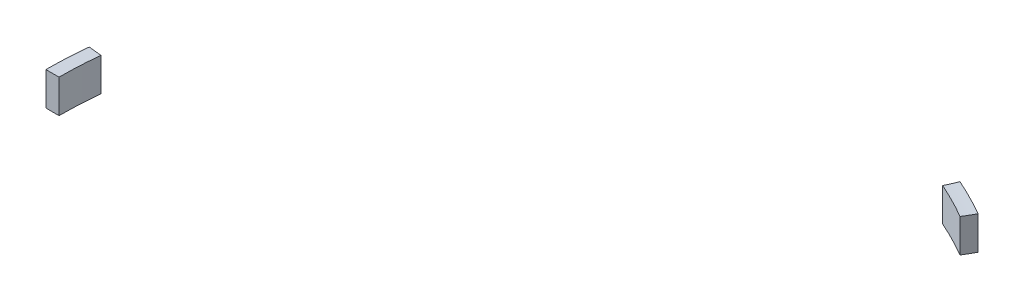
ISO-10303-21;
HEADER;
FILE_DESCRIPTION(('STEP AP214'),'2;1');
FILE_NAME('part.step','',(''),(''),'','','');
FILE_SCHEMA(('AUTOMOTIVE_DESIGN { 1 0 10303 214 1 1 1 1 }'));
ENDSEC;
DATA;
#1=APPLICATION_CONTEXT('core data for automotive mechanical design processes');
#2=APPLICATION_PROTOCOL_DEFINITION('international standard','automotive_design',2000,#1);
#3=PRODUCT_CONTEXT('',#1,'mechanical');
#4=PRODUCT('Part','Part','',(#3));
#5=PRODUCT_RELATED_PRODUCT_CATEGORY('part','',(#4));
#6=PRODUCT_DEFINITION_FORMATION('','',#4);
#7=PRODUCT_DEFINITION_CONTEXT('part definition',#1,'design');
#8=PRODUCT_DEFINITION('design','',#6,#7);
#9=PRODUCT_DEFINITION_SHAPE('','',#8);
#10=(LENGTH_UNIT() NAMED_UNIT(*) SI_UNIT(.MILLI.,.METRE.));
#11=(NAMED_UNIT(*) PLANE_ANGLE_UNIT() SI_UNIT($,.RADIAN.));
#12=(NAMED_UNIT(*) SI_UNIT($,.STERADIAN.) SOLID_ANGLE_UNIT());
#13=UNCERTAINTY_MEASURE_WITH_UNIT(LENGTH_MEASURE(1.E-05),#10,'distance_accuracy_value','');
#14=(GEOMETRIC_REPRESENTATION_CONTEXT(3) GLOBAL_UNCERTAINTY_ASSIGNED_CONTEXT((#13)) GLOBAL_UNIT_ASSIGNED_CONTEXT((#10,
#11,#12)) REPRESENTATION_CONTEXT('',''));
#15=CARTESIAN_POINT('',(0.,0.,0.));
#16=DIRECTION('',(0.,0.,1.));
#17=DIRECTION('',(1.,0.,0.));
#18=AXIS2_PLACEMENT_3D('',#15,#16,#17);
#19=CARTESIAN_POINT('',(44.2949999999999,0.,-25.5737301737545));
#20=DIRECTION('',(-0.86602540378444,0.,-0.499999999999998));
#21=DIRECTION('',(-0.499999999999998,0.,0.86602540378444));
#22=AXIS2_PLACEMENT_3D('',#19,#20,#21);
#23=PLANE('',#22);
#24=CARTESIAN_POINT('',(44.2949999999999,0.,-25.5737301737545));
#25=DIRECTION('',(-0.86602540378444,0.,-0.499999999999998));
#26=DIRECTION('',(-0.499999999999998,0.,0.86602540378444));
#27=AXIS2_PLACEMENT_3D('',#24,#25,#26);
#28=CIRCLE('',#27,16.105);
#29=CARTESIAN_POINT('',(44.5449999999999,-16.0972365640814,-26.0067428756467));
#30=VERTEX_POINT('',#29);
#31=CARTESIAN_POINT('',(44.0449999999999,-16.0972365640814,-25.1407174718623));
#32=VERTEX_POINT('',#31);
#33=EDGE_CURVE('E88',#30,#32,#28,.T.);
#34=ORIENTED_EDGE('',*,*,#33,.F.);
#35=DIRECTION('',(0.,-1.,0.));
#36=VECTOR('',#35,1.);
#37=CARTESIAN_POINT('',(44.5449999999999,-13.5507785754177,-26.0067428756467));
#38=LINE('',#37,#36);
#39=CARTESIAN_POINT('',(44.5449999999999,-13.5507785754177,-26.0067428756467));
#40=VERTEX_POINT('',#39);
#41=EDGE_CURVE('E86',#40,#30,#38,.T.);
#42=ORIENTED_EDGE('',*,*,#41,.F.);
#43=CARTESIAN_POINT('',(44.2949999999999,0.,-25.5737301737545));
#44=DIRECTION('',(0.86602540378444,0.,0.499999999999998));
#45=DIRECTION('',(-0.499999999999998,0.,0.86602540378444));
#46=AXIS2_PLACEMENT_3D('',#43,#44,#45);
#47=CIRCLE('',#46,13.56);
#48=CARTESIAN_POINT('',(44.0449999999999,-13.5507785754177,-25.1407174718623));
#49=VERTEX_POINT('',#48);
#50=EDGE_CURVE('E108',#49,#40,#47,.T.);
#51=ORIENTED_EDGE('',*,*,#50,.F.);
#52=DIRECTION('',(0.,1.,0.));
#53=VECTOR('',#52,1.);
#54=CARTESIAN_POINT('',(44.0449999999999,-13.5507785754177,-25.1407174718623));
#55=LINE('',#54,#53);
#56=EDGE_CURVE('E79',#32,#49,#55,.T.);
#57=ORIENTED_EDGE('',*,*,#56,.F.);
#58=EDGE_LOOP('',(#34,#42,#51,#57));
#59=FACE_BOUND('',#58,.T.);
#60=ADVANCED_FACE('F43',(#59),#23,.F.);
#61=CARTESIAN_POINT('',(29.53,0.,0.));
#62=DIRECTION('',(0.,1.,0.));
#63=DIRECTION('',(0.,0.,1.));
#64=AXIS2_PLACEMENT_3D('',#61,#62,#63);
#65=TOROIDAL_SURFACE('',#64,29.53,16.105);
#66=CARTESIAN_POINT('',(41.5409330700285,0.,-26.976997364186));
#67=DIRECTION('',(0.913545457642599,0.,0.406736643075804));
#68=DIRECTION('',(0.406736643075804,0.,-0.913545457642599));
#69=AXIS2_PLACEMENT_3D('',#66,#67,#68);
#70=CIRCLE('',#69,16.105);
#71=CARTESIAN_POINT('',(41.7443013915664,-16.0972365640814,-27.4337700930073));
#72=VERTEX_POINT('',#71);
#73=CARTESIAN_POINT('',(41.3375647484906,-16.0972365640814,-26.5202246353646));
#74=VERTEX_POINT('',#73);
#75=EDGE_CURVE('E72',#72,#74,#70,.F.);
#76=ORIENTED_EDGE('',*,*,#75,.F.);
#77=CARTESIAN_POINT('',(29.53,-16.0972365640814,0.));
#78=DIRECTION('',(0.,1.,0.));
#79=DIRECTION('',(0.499999999999998,0.,-0.86602540378444));
#80=AXIS2_PLACEMENT_3D('',#77,#78,#79);
#81=CIRCLE('',#80,30.03);
#82=EDGE_CURVE('E47',#30,#72,#81,.T.);
#83=ORIENTED_EDGE('',*,*,#82,.F.);
#84=ORIENTED_EDGE('',*,*,#33,.T.);
#85=CARTESIAN_POINT('',(29.53,-16.0972365640814,0.));
#86=DIRECTION('',(0.,1.,0.));
#87=DIRECTION('',(0.499999999999998,0.,-0.86602540378444));
#88=AXIS2_PLACEMENT_3D('',#85,#86,#87);
#89=CIRCLE('',#88,29.03);
#90=EDGE_CURVE('E93',#32,#74,#89,.T.);
#91=ORIENTED_EDGE('',*,*,#90,.T.);
#92=EDGE_LOOP('',(#76,#83,#84,#91));
#93=FACE_BOUND('',#92,.T.);
#94=ADVANCED_FACE('F45',(#93),#65,.T.);
#95=CARTESIAN_POINT('',(29.53,0.,0.));
#96=DIRECTION('',(0.,1.,0.));
#97=DIRECTION('',(0.,0.,1.));
#98=AXIS2_PLACEMENT_3D('',#95,#96,#97);
#99=CYLINDRICAL_SURFACE('',#98,29.03);
#100=DIRECTION('',(0.,1.,0.));
#101=VECTOR('',#100,1.);
#102=CARTESIAN_POINT('',(41.3375647484906,-20.,-26.5202246353646));
#103=LINE('',#102,#101);
#104=CARTESIAN_POINT('',(41.3375647484906,-13.5507785754177,-26.5202246353646));
#105=VERTEX_POINT('',#104);
#106=EDGE_CURVE('E69',#74,#105,#103,.T.);
#107=ORIENTED_EDGE('',*,*,#106,.F.);
#108=ORIENTED_EDGE('',*,*,#90,.F.);
#109=ORIENTED_EDGE('',*,*,#56,.T.);
#110=CARTESIAN_POINT('',(29.53,-13.5507785754177,0.));
#111=DIRECTION('',(0.,1.,0.));
#112=DIRECTION('',(0.499999999999998,0.,-0.86602540378444));
#113=AXIS2_PLACEMENT_3D('',#110,#111,#112);
#114=CIRCLE('',#113,29.03);
#115=EDGE_CURVE('E109',#49,#105,#114,.T.);
#116=ORIENTED_EDGE('',*,*,#115,.T.);
#117=EDGE_LOOP('',(#107,#108,#109,#116));
#118=FACE_BOUND('',#117,.T.);
#119=ADVANCED_FACE('F116',(#118),#99,.F.);
#120=CARTESIAN_POINT('',(29.53,0.,0.));
#121=DIRECTION('',(0.,1.,0.));
#122=DIRECTION('',(0.,0.,1.));
#123=AXIS2_PLACEMENT_3D('',#120,#121,#122);
#124=TOROIDAL_SURFACE('',#123,29.53,13.56);
#125=CARTESIAN_POINT('',(41.5409330700285,0.,-26.976997364186));
#126=DIRECTION('',(0.913545457642599,0.,0.406736643075804));
#127=DIRECTION('',(0.406736643075804,0.,-0.913545457642599));
#128=AXIS2_PLACEMENT_3D('',#125,#126,#127);
#129=CIRCLE('',#128,13.56);
#130=CARTESIAN_POINT('',(41.7443013915664,-13.5507785754177,-27.4337700930073));
#131=VERTEX_POINT('',#130);
#132=EDGE_CURVE('E53',#105,#131,#129,.T.);
#133=ORIENTED_EDGE('',*,*,#132,.F.);
#134=ORIENTED_EDGE('',*,*,#115,.F.);
#135=ORIENTED_EDGE('',*,*,#50,.T.);
#136=CARTESIAN_POINT('',(29.53,-13.5507785754177,0.));
#137=DIRECTION('',(0.,1.,0.));
#138=DIRECTION('',(0.499999999999998,0.,-0.86602540378444));
#139=AXIS2_PLACEMENT_3D('',#136,#137,#138);
#140=CIRCLE('',#139,30.03);
#141=EDGE_CURVE('E100',#40,#131,#140,.T.);
#142=ORIENTED_EDGE('',*,*,#141,.T.);
#143=EDGE_LOOP('',(#133,#134,#135,#142));
#144=FACE_BOUND('',#143,.T.);
#145=ADVANCED_FACE('F115',(#144),#124,.F.);
#146=CARTESIAN_POINT('',(29.53,0.,0.));
#147=DIRECTION('',(0.,1.,0.));
#148=DIRECTION('',(0.,0.,1.));
#149=AXIS2_PLACEMENT_3D('',#146,#147,#148);
#150=CYLINDRICAL_SURFACE('',#149,30.03);
#151=DIRECTION('',(0.,1.,0.));
#152=VECTOR('',#151,1.);
#153=CARTESIAN_POINT('',(41.7443013915664,0.,-27.4337700930072));
#154=LINE('',#153,#152);
#155=EDGE_CURVE('E12',#131,#72,#154,.F.);
#156=ORIENTED_EDGE('',*,*,#155,.F.);
#157=ORIENTED_EDGE('',*,*,#141,.F.);
#158=ORIENTED_EDGE('',*,*,#41,.T.);
#159=ORIENTED_EDGE('',*,*,#82,.T.);
#160=EDGE_LOOP('',(#156,#157,#158,#159));
#161=FACE_BOUND('',#160,.T.);
#162=ADVANCED_FACE('F98',(#161),#150,.T.);
#163=CARTESIAN_POINT('',(24.6447134028884,-20.,10.9725333481738));
#164=DIRECTION('',(0.913545457642599,0.,0.406736643075804));
#165=DIRECTION('',(0.406736643075804,0.,-0.913545457642599));
#166=AXIS2_PLACEMENT_3D('',#163,#164,#165);
#167=PLANE('',#166);
#168=ORIENTED_EDGE('',*,*,#75,.T.);
#169=ORIENTED_EDGE('',*,*,#106,.T.);
#170=ORIENTED_EDGE('',*,*,#132,.T.);
#171=ORIENTED_EDGE('',*,*,#155,.T.);
#172=EDGE_LOOP('',(#168,#169,#170,#171));
#173=FACE_BOUND('',#172,.T.);
#174=ADVANCED_FACE('F124',(#173),#167,.F.);
#175=CLOSED_SHELL('',(#60,#94,#119,#145,#162,#174));
#176=MANIFOLD_SOLID_BREP('B2',#175);
#177=CARTESIAN_POINT('',(0.,0.,0.));
#178=DIRECTION('',(0.,0.,1.));
#179=DIRECTION('',(1.,0.,0.));
#180=AXIS2_PLACEMENT_3D('',#177,#178,#179);
#181=PLANE('',#180);
#182=CARTESIAN_POINT('',(0.,0.,0.));
#183=DIRECTION('',(0.,0.,1.));
#184=DIRECTION('',(1.,0.,0.));
#185=AXIS2_PLACEMENT_3D('',#182,#183,#184);
#186=CIRCLE('',#185,16.105);
#187=CARTESIAN_POINT('',(-0.499999999999989,-16.0972365640814,0.));
#188=VERTEX_POINT('',#187);
#189=CARTESIAN_POINT('',(0.500000000000013,-16.0972365640814,0.));
#190=VERTEX_POINT('',#189);
#191=EDGE_CURVE('E232',#188,#190,#186,.T.);
#192=ORIENTED_EDGE('',*,*,#191,.T.);
#193=DIRECTION('',(0.,1.,0.));
#194=VECTOR('',#193,1.);
#195=CARTESIAN_POINT('',(0.500000000000012,-13.5507785754177,0.));
#196=LINE('',#195,#194);
#197=CARTESIAN_POINT('',(0.500000000000013,-13.5507785754177,0.));
#198=VERTEX_POINT('',#197);
#199=EDGE_CURVE('E226',#190,#198,#196,.T.);
#200=ORIENTED_EDGE('',*,*,#199,.T.);
#201=CARTESIAN_POINT('',(0.,0.,0.));
#202=DIRECTION('',(0.,0.,-1.));
#203=DIRECTION('',(1.,0.,0.));
#204=AXIS2_PLACEMENT_3D('',#201,#202,#203);
#205=CIRCLE('',#204,13.56);
#206=CARTESIAN_POINT('',(-0.499999999999994,-13.5507785754177,0.));
#207=VERTEX_POINT('',#206);
#208=EDGE_CURVE('E221',#198,#207,#205,.T.);
#209=ORIENTED_EDGE('',*,*,#208,.T.);
#210=DIRECTION('',(0.,-1.,0.));
#211=VECTOR('',#210,1.);
#212=CARTESIAN_POINT('',(-0.499999999999989,-13.5507785754177,0.));
#213=LINE('',#212,#211);
#214=EDGE_CURVE('E177',#207,#188,#213,.T.);
#215=ORIENTED_EDGE('',*,*,#214,.T.);
#216=EDGE_LOOP('',(#192,#200,#209,#215));
#217=FACE_BOUND('',#216,.T.);
#218=ADVANCED_FACE('F170',(#217),#181,.T.);
#219=CARTESIAN_POINT('',(29.53,0.,0.));
#220=DIRECTION('',(0.,1.,0.));
#221=DIRECTION('',(0.,0.,1.));
#222=AXIS2_PLACEMENT_3D('',#219,#220,#221);
#223=CYLINDRICAL_SURFACE('',#222,30.03);
#224=CARTESIAN_POINT('',(29.53,-13.5507785754177,0.));
#225=DIRECTION('',(0.,1.,0.));
#226=DIRECTION('',(0.499999999999998,0.,-0.86602540378444));
#227=AXIS2_PLACEMENT_3D('',#224,#225,#226);
#228=CIRCLE('',#227,30.03);
#229=CARTESIAN_POINT('',(-0.335492517909239,-13.5507785754177,-3.13898975192764));
#230=VERTEX_POINT('',#229);
#231=EDGE_CURVE('E191',#230,#207,#228,.T.);
#232=ORIENTED_EDGE('',*,*,#231,.F.);
#233=DIRECTION('',(0.,1.,0.));
#234=VECTOR('',#233,1.);
#235=CARTESIAN_POINT('',(-0.33549251790924,0.,-3.13898975192764));
#236=LINE('',#235,#234);
#237=CARTESIAN_POINT('',(-0.33549251790924,-16.0972365640814,-3.13898975192764));
#238=VERTEX_POINT('',#237);
#239=EDGE_CURVE('E41',#230,#238,#236,.F.);
#240=ORIENTED_EDGE('',*,*,#239,.T.);
#241=CARTESIAN_POINT('',(29.53,-16.0972365640814,0.));
#242=DIRECTION('',(0.,1.,0.));
#243=DIRECTION('',(0.499999999999998,0.,-0.86602540378444));
#244=AXIS2_PLACEMENT_3D('',#241,#242,#243);
#245=CIRCLE('',#244,30.03);
#246=EDGE_CURVE('E230',#238,#188,#245,.T.);
#247=ORIENTED_EDGE('',*,*,#246,.T.);
#248=ORIENTED_EDGE('',*,*,#214,.F.);
#249=EDGE_LOOP('',(#232,#240,#247,#248));
#250=FACE_BOUND('',#249,.T.);
#251=ADVANCED_FACE('F219',(#250),#223,.T.);
#252=CARTESIAN_POINT('',(29.53,0.,0.));
#253=DIRECTION('',(0.,1.,0.));
#254=DIRECTION('',(0.,0.,1.));
#255=AXIS2_PLACEMENT_3D('',#252,#253,#254);
#256=TOROIDAL_SURFACE('',#255,29.53,13.56);
#257=CARTESIAN_POINT('',(29.53,-13.5507785754177,0.));
#258=DIRECTION('',(0.,1.,0.));
#259=DIRECTION('',(0.499999999999998,0.,-0.86602540378444));
#260=AXIS2_PLACEMENT_3D('',#257,#258,#259);
#261=CIRCLE('',#260,29.03);
#262=CARTESIAN_POINT('',(0.659029377459038,-13.5507785754177,-3.03446128865998));
#263=VERTEX_POINT('',#262);
#264=EDGE_CURVE('E215',#263,#198,#261,.T.);
#265=ORIENTED_EDGE('',*,*,#264,.F.);
#266=CARTESIAN_POINT('',(0.161768429774885,0.,-3.08672552029381));
#267=DIRECTION('',(0.104528463267654,0.,-0.994521895368273));
#268=DIRECTION('',(-0.994521895368273,0.,-0.104528463267654));
#269=AXIS2_PLACEMENT_3D('',#266,#267,#268);
#270=CIRCLE('',#269,13.56);
#271=EDGE_CURVE('E209',#263,#230,#270,.T.);
#272=ORIENTED_EDGE('',*,*,#271,.T.);
#273=ORIENTED_EDGE('',*,*,#231,.T.);
#274=ORIENTED_EDGE('',*,*,#208,.F.);
#275=EDGE_LOOP('',(#265,#272,#273,#274));
#276=FACE_BOUND('',#275,.T.);
#277=ADVANCED_FACE('F214',(#276),#256,.F.);
#278=CARTESIAN_POINT('',(29.53,0.,0.));
#279=DIRECTION('',(0.,1.,0.));
#280=DIRECTION('',(0.,0.,1.));
#281=AXIS2_PLACEMENT_3D('',#278,#279,#280);
#282=CYLINDRICAL_SURFACE('',#281,29.03);
#283=CARTESIAN_POINT('',(29.53,-16.0972365640814,0.));
#284=DIRECTION('',(0.,1.,0.));
#285=DIRECTION('',(0.499999999999998,0.,-0.86602540378444));
#286=AXIS2_PLACEMENT_3D('',#283,#284,#285);
#287=CIRCLE('',#286,29.03);
#288=CARTESIAN_POINT('',(0.659029377459038,-16.0972365640814,-3.03446128865998));
#289=VERTEX_POINT('',#288);
#290=EDGE_CURVE('E229',#289,#190,#287,.T.);
#291=ORIENTED_EDGE('',*,*,#290,.F.);
#292=DIRECTION('',(0.,1.,0.));
#293=VECTOR('',#292,1.);
#294=CARTESIAN_POINT('',(0.659029377459038,-20.,-3.03446128865998));
#295=LINE('',#294,#293);
#296=EDGE_CURVE('E216',#289,#263,#295,.T.);
#297=ORIENTED_EDGE('',*,*,#296,.T.);
#298=ORIENTED_EDGE('',*,*,#264,.T.);
#299=ORIENTED_EDGE('',*,*,#199,.F.);
#300=EDGE_LOOP('',(#291,#297,#298,#299));
#301=FACE_BOUND('',#300,.T.);
#302=ADVANCED_FACE('F239',(#301),#282,.F.);
#303=CARTESIAN_POINT('',(29.53,0.,0.));
#304=DIRECTION('',(0.,1.,0.));
#305=DIRECTION('',(0.,0.,1.));
#306=AXIS2_PLACEMENT_3D('',#303,#304,#305);
#307=TOROIDAL_SURFACE('',#306,29.53,16.105);
#308=ORIENTED_EDGE('',*,*,#246,.F.);
#309=CARTESIAN_POINT('',(0.161768429774885,0.,-3.08672552029381));
#310=DIRECTION('',(0.104528463267654,0.,-0.994521895368273));
#311=DIRECTION('',(-0.994521895368273,0.,-0.104528463267654));
#312=AXIS2_PLACEMENT_3D('',#309,#310,#311);
#313=CIRCLE('',#312,16.105);
#314=EDGE_CURVE('E184',#238,#289,#313,.F.);
#315=ORIENTED_EDGE('',*,*,#314,.T.);
#316=ORIENTED_EDGE('',*,*,#290,.T.);
#317=ORIENTED_EDGE('',*,*,#191,.F.);
#318=EDGE_LOOP('',(#308,#315,#316,#317));
#319=FACE_BOUND('',#318,.T.);
#320=ADVANCED_FACE('F242',(#319),#307,.T.);
#321=CARTESIAN_POINT('',(0.32265067516536,-20.,-3.06981611492422));
#322=DIRECTION('',(0.104528463267654,0.,-0.994521895368273));
#323=DIRECTION('',(-0.994521895368273,0.,-0.104528463267654));
#324=AXIS2_PLACEMENT_3D('',#321,#322,#323);
#325=PLANE('',#324);
#326=ORIENTED_EDGE('',*,*,#239,.F.);
#327=ORIENTED_EDGE('',*,*,#271,.F.);
#328=ORIENTED_EDGE('',*,*,#296,.F.);
#329=ORIENTED_EDGE('',*,*,#314,.F.);
#330=EDGE_LOOP('',(#326,#327,#328,#329));
#331=FACE_BOUND('',#330,.T.);
#332=ADVANCED_FACE('F208',(#331),#325,.T.);
#333=CLOSED_SHELL('',(#218,#251,#277,#302,#320,#332));
#334=MANIFOLD_SOLID_BREP('B6',#333);
#335=ADVANCED_BREP_SHAPE_REPRESENTATION('',(#18,#176,#334),#14);
#336=SHAPE_DEFINITION_REPRESENTATION(#9,#335);
ENDSEC;
END-ISO-10303-21;
